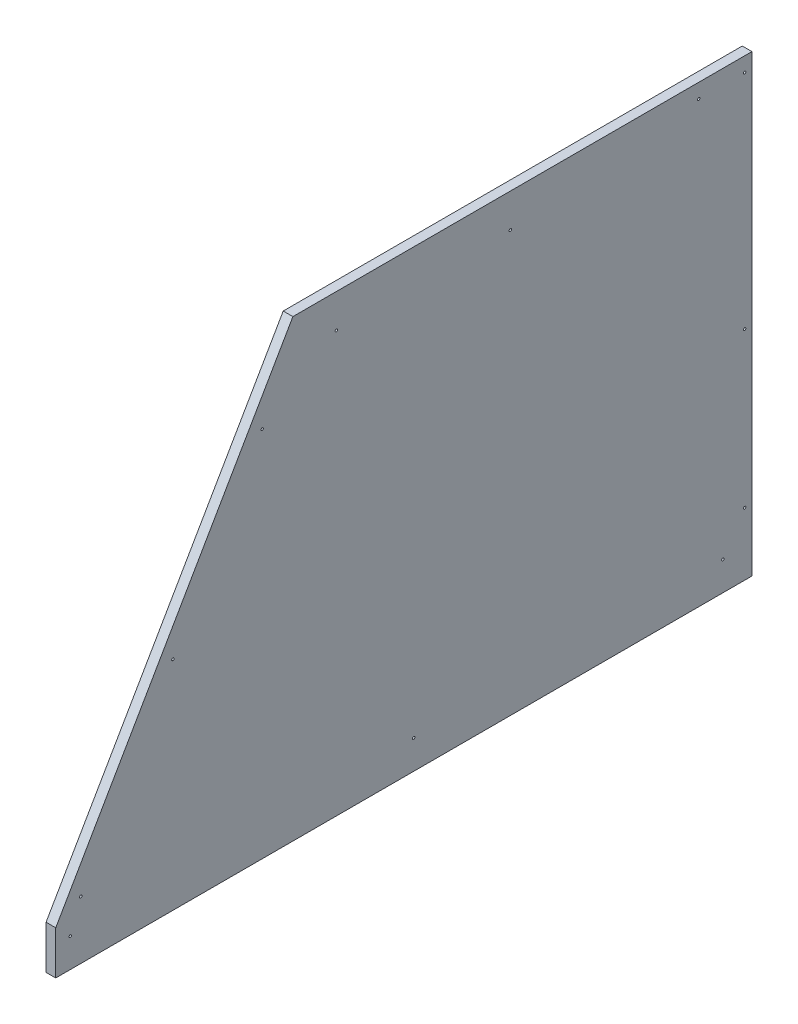
ISO-10303-21;
HEADER;
FILE_DESCRIPTION(('STEP AP214'),'2;1');
FILE_NAME('part.step','',(''),(''),'','','');
FILE_SCHEMA(('AUTOMOTIVE_DESIGN { 1 0 10303 214 1 1 1 1 }'));
ENDSEC;
DATA;
#1=APPLICATION_CONTEXT('core data for automotive mechanical design processes');
#2=APPLICATION_PROTOCOL_DEFINITION('international standard','automotive_design',2000,#1);
#3=PRODUCT_CONTEXT('',#1,'mechanical');
#4=PRODUCT('Part','Part','',(#3));
#5=PRODUCT_RELATED_PRODUCT_CATEGORY('part','',(#4));
#6=PRODUCT_DEFINITION_FORMATION('','',#4);
#7=PRODUCT_DEFINITION_CONTEXT('part definition',#1,'design');
#8=PRODUCT_DEFINITION('design','',#6,#7);
#9=PRODUCT_DEFINITION_SHAPE('','',#8);
#10=(LENGTH_UNIT() NAMED_UNIT(*) SI_UNIT(.MILLI.,.METRE.));
#11=(NAMED_UNIT(*) PLANE_ANGLE_UNIT() SI_UNIT($,.RADIAN.));
#12=(NAMED_UNIT(*) SI_UNIT($,.STERADIAN.) SOLID_ANGLE_UNIT());
#13=UNCERTAINTY_MEASURE_WITH_UNIT(LENGTH_MEASURE(1.E-05),#10,'distance_accuracy_value','');
#14=(GEOMETRIC_REPRESENTATION_CONTEXT(3) GLOBAL_UNCERTAINTY_ASSIGNED_CONTEXT((#13)) GLOBAL_UNIT_ASSIGNED_CONTEXT((#10,
#11,#12)) REPRESENTATION_CONTEXT('',''));
#15=CARTESIAN_POINT('',(0.,0.,0.));
#16=DIRECTION('',(0.,0.,1.));
#17=DIRECTION('',(1.,0.,0.));
#18=AXIS2_PLACEMENT_3D('',#15,#16,#17);
#19=CARTESIAN_POINT('',(622.3,0.,0.));
#20=DIRECTION('',(-1.,0.,0.));
#21=DIRECTION('',(0.,0.,1.));
#22=AXIS2_PLACEMENT_3D('',#19,#20,#21);
#23=PLANE('',#22);
#24=CARTESIAN_POINT('',(622.3,82.55,-593.725));
#25=DIRECTION('',(-1.,0.,0.));
#26=DIRECTION('',(0.,0.,1.));
#27=AXIS2_PLACEMENT_3D('',#24,#25,#26);
#28=CIRCLE('',#27,1.5875);
#29=CARTESIAN_POINT('',(622.3,82.55,-592.1375));
#30=VERTEX_POINT('',#29);
#31=EDGE_CURVE('E121',#30,#30,#28,.T.);
#32=ORIENTED_EDGE('',*,*,#31,.T.);
#33=EDGE_LOOP('',(#32));
#34=FACE_BOUND('',#33,.T.);
#35=CARTESIAN_POINT('',(622.3,488.95,40.3279163028834));
#36=DIRECTION('',(-1.,0.,0.));
#37=DIRECTION('',(0.,0.,1.));
#38=AXIS2_PLACEMENT_3D('',#35,#36,#37);
#39=CIRCLE('',#38,1.5875);
#40=CARTESIAN_POINT('',(622.3,488.95,41.9154163028834));
#41=VERTEX_POINT('',#40);
#42=EDGE_CURVE('E125',#41,#41,#39,.T.);
#43=ORIENTED_EDGE('',*,*,#42,.T.);
#44=EDGE_LOOP('',(#43));
#45=FACE_BOUND('',#44,.T.);
#46=CARTESIAN_POINT('',(622.3,552.45,-285.75));
#47=DIRECTION('',(-1.,0.,0.));
#48=DIRECTION('',(0.,0.,1.));
#49=AXIS2_PLACEMENT_3D('',#46,#47,#48);
#50=CIRCLE('',#49,1.5875);
#51=CARTESIAN_POINT('',(622.3,552.45,-284.1625));
#52=VERTEX_POINT('',#51);
#53=EDGE_CURVE('E128',#52,#52,#50,.T.);
#54=ORIENTED_EDGE('',*,*,#53,.T.);
#55=EDGE_LOOP('',(#54));
#56=FACE_BOUND('',#55,.T.);
#57=CARTESIAN_POINT('',(622.3,38.1,-158.75));
#58=DIRECTION('',(-1.,0.,0.));
#59=DIRECTION('',(0.,0.,1.));
#60=AXIS2_PLACEMENT_3D('',#57,#58,#59);
#61=CIRCLE('',#60,1.5875);
#62=CARTESIAN_POINT('',(622.3,38.1,-157.1625));
#63=VERTEX_POINT('',#62);
#64=EDGE_CURVE('E131',#63,#63,#61,.T.);
#65=ORIENTED_EDGE('',*,*,#64,.T.);
#66=EDGE_LOOP('',(#65));
#67=FACE_BOUND('',#66,.T.);
#68=CARTESIAN_POINT('',(622.3,285.75,157.645491002215));
#69=DIRECTION('',(-1.,0.,0.));
#70=DIRECTION('',(0.,0.,1.));
#71=AXIS2_PLACEMENT_3D('',#68,#69,#70);
#72=CIRCLE('',#71,1.5875);
#73=CARTESIAN_POINT('',(622.3,285.75,159.232991002215));
#74=VERTEX_POINT('',#73);
#75=EDGE_CURVE('E134',#74,#74,#72,.T.);
#76=ORIENTED_EDGE('',*,*,#75,.T.);
#77=EDGE_LOOP('',(#76));
#78=FACE_BOUND('',#77,.T.);
#79=CARTESIAN_POINT('',(622.3,38.1,292.574807795112));
#80=DIRECTION('',(-1.,0.,0.));
#81=DIRECTION('',(0.,0.,1.));
#82=AXIS2_PLACEMENT_3D('',#79,#80,#81);
#83=CIRCLE('',#82,1.5875);
#84=CARTESIAN_POINT('',(622.3,38.1,294.162307795112));
#85=VERTEX_POINT('',#84);
#86=EDGE_CURVE('E137',#85,#85,#83,.T.);
#87=ORIENTED_EDGE('',*,*,#86,.T.);
#88=EDGE_LOOP('',(#87));
#89=FACE_BOUND('',#88,.T.);
#90=CARTESIAN_POINT('',(622.3,38.1,-565.15));
#91=DIRECTION('',(-1.,0.,0.));
#92=DIRECTION('',(0.,0.,1.));
#93=AXIS2_PLACEMENT_3D('',#90,#91,#92);
#94=CIRCLE('',#93,1.5875);
#95=CARTESIAN_POINT('',(622.3,38.1,-563.5625));
#96=VERTEX_POINT('',#95);
#97=EDGE_CURVE('E140',#96,#96,#94,.T.);
#98=ORIENTED_EDGE('',*,*,#97,.T.);
#99=EDGE_LOOP('',(#98));
#100=FACE_BOUND('',#99,.T.);
#101=CARTESIAN_POINT('',(622.3,285.75,-593.725));
#102=DIRECTION('',(-1.,0.,0.));
#103=DIRECTION('',(0.,0.,1.));
#104=AXIS2_PLACEMENT_3D('',#101,#102,#103);
#105=CIRCLE('',#104,1.5875);
#106=CARTESIAN_POINT('',(622.3,285.75,-592.1375));
#107=VERTEX_POINT('',#106);
#108=EDGE_CURVE('E143',#107,#107,#105,.T.);
#109=ORIENTED_EDGE('',*,*,#108,.T.);
#110=EDGE_LOOP('',(#109));
#111=FACE_BOUND('',#110,.T.);
#112=CARTESIAN_POINT('',(622.3,577.85,-593.725));
#113=DIRECTION('',(-1.,0.,0.));
#114=DIRECTION('',(0.,0.,1.));
#115=AXIS2_PLACEMENT_3D('',#112,#113,#114);
#116=CIRCLE('',#115,1.5875);
#117=CARTESIAN_POINT('',(622.3,577.85,-592.1375));
#118=VERTEX_POINT('',#117);
#119=EDGE_CURVE('E146',#118,#118,#116,.T.);
#120=ORIENTED_EDGE('',*,*,#119,.T.);
#121=EDGE_LOOP('',(#120));
#122=FACE_BOUND('',#121,.T.);
#123=CARTESIAN_POINT('',(622.3,76.2,278.62923991084));
#124=DIRECTION('',(-1.,0.,0.));
#125=DIRECTION('',(0.,0.,1.));
#126=AXIS2_PLACEMENT_3D('',#123,#124,#125);
#127=CIRCLE('',#126,1.5875);
#128=CARTESIAN_POINT('',(622.3,76.2,280.21673991084));
#129=VERTEX_POINT('',#128);
#130=EDGE_CURVE('E149',#129,#129,#127,.T.);
#131=ORIENTED_EDGE('',*,*,#130,.T.);
#132=EDGE_LOOP('',(#131));
#133=FACE_BOUND('',#132,.T.);
#134=CARTESIAN_POINT('',(622.3,552.45,-57.15));
#135=DIRECTION('',(-1.,0.,0.));
#136=DIRECTION('',(0.,0.,1.));
#137=AXIS2_PLACEMENT_3D('',#134,#135,#136);
#138=CIRCLE('',#137,1.5875);
#139=CARTESIAN_POINT('',(622.3,552.45,-55.5625));
#140=VERTEX_POINT('',#139);
#141=EDGE_CURVE('E151',#140,#140,#138,.T.);
#142=ORIENTED_EDGE('',*,*,#141,.T.);
#143=EDGE_LOOP('',(#142));
#144=FACE_BOUND('',#143,.T.);
#145=CARTESIAN_POINT('',(622.3,577.85,-533.4));
#146=DIRECTION('',(-1.,0.,0.));
#147=DIRECTION('',(0.,0.,1.));
#148=AXIS2_PLACEMENT_3D('',#145,#146,#147);
#149=CIRCLE('',#148,1.5875);
#150=CARTESIAN_POINT('',(622.3,577.85,-531.8125));
#151=VERTEX_POINT('',#150);
#152=EDGE_CURVE('E19',#151,#151,#149,.T.);
#153=ORIENTED_EDGE('',*,*,#152,.T.);
#154=EDGE_LOOP('',(#153));
#155=FACE_BOUND('',#154,.T.);
#156=DIRECTION('',(0.,0.866025403784429,-0.500000000000017));
#157=VECTOR('',#156,1.);
#158=CARTESIAN_POINT('',(622.3,57.15,311.624807795112));
#159=LINE('',#158,#157);
#160=CARTESIAN_POINT('',(622.3,596.9,-4.57966997657877E-13));
#161=VERTEX_POINT('',#160);
#162=CARTESIAN_POINT('',(622.3,57.15,311.624807795112));
#163=VERTEX_POINT('',#162);
#164=EDGE_CURVE('E61',#161,#163,#159,.F.);
#165=ORIENTED_EDGE('',*,*,#164,.T.);
#166=DIRECTION('',(0.,1.,0.));
#167=VECTOR('',#166,1.);
#168=CARTESIAN_POINT('',(622.3,0.,311.624807795112));
#169=LINE('',#168,#167);
#170=CARTESIAN_POINT('',(622.3,0.,311.624807795112));
#171=VERTEX_POINT('',#170);
#172=EDGE_CURVE('E63',#163,#171,#169,.F.);
#173=ORIENTED_EDGE('',*,*,#172,.T.);
#174=DIRECTION('',(0.,0.,1.));
#175=VECTOR('',#174,1.);
#176=CARTESIAN_POINT('',(622.3,0.,0.));
#177=LINE('',#176,#175);
#178=CARTESIAN_POINT('',(622.3,0.,-603.25));
#179=VERTEX_POINT('',#178);
#180=EDGE_CURVE('E65',#171,#179,#177,.F.);
#181=ORIENTED_EDGE('',*,*,#180,.T.);
#182=DIRECTION('',(0.,1.,0.));
#183=VECTOR('',#182,1.);
#184=CARTESIAN_POINT('',(622.3,596.9,-603.25));
#185=LINE('',#184,#183);
#186=CARTESIAN_POINT('',(622.3,596.9,-603.25));
#187=VERTEX_POINT('',#186);
#188=EDGE_CURVE('E158',#179,#187,#185,.T.);
#189=ORIENTED_EDGE('',*,*,#188,.T.);
#190=DIRECTION('',(0.,0.,-1.));
#191=VECTOR('',#190,1.);
#192=CARTESIAN_POINT('',(622.3,596.9,0.));
#193=LINE('',#192,#191);
#194=EDGE_CURVE('E167',#187,#161,#193,.F.);
#195=ORIENTED_EDGE('',*,*,#194,.T.);
#196=EDGE_LOOP('',(#165,#173,#181,#189,#195));
#197=FACE_BOUND('',#196,.T.);
#198=ADVANCED_FACE('F16',(#34,#45,#56,#67,#78,#89,#100,#111,#122,#133,#144,#155,#197),#23,.F.);
#199=CARTESIAN_POINT('',(609.6,0.,0.));
#200=DIRECTION('',(0.,1.,0.));
#201=DIRECTION('',(0.,0.,1.));
#202=AXIS2_PLACEMENT_3D('',#199,#200,#201);
#203=PLANE('',#202);
#204=ORIENTED_EDGE('',*,*,#180,.F.);
#205=DIRECTION('',(-1.,0.,0.));
#206=VECTOR('',#205,1.);
#207=CARTESIAN_POINT('',(609.6,0.,311.624807795112));
#208=LINE('',#207,#206);
#209=CARTESIAN_POINT('',(609.6,0.,311.624807795112));
#210=VERTEX_POINT('',#209);
#211=EDGE_CURVE('E70',#171,#210,#208,.T.);
#212=ORIENTED_EDGE('',*,*,#211,.T.);
#213=DIRECTION('',(0.,0.,1.));
#214=VECTOR('',#213,1.);
#215=CARTESIAN_POINT('',(609.6,0.,0.));
#216=LINE('',#215,#214);
#217=CARTESIAN_POINT('',(609.6,0.,-603.25));
#218=VERTEX_POINT('',#217);
#219=EDGE_CURVE('E124',#218,#210,#216,.T.);
#220=ORIENTED_EDGE('',*,*,#219,.F.);
#221=DIRECTION('',(1.,0.,0.));
#222=VECTOR('',#221,1.);
#223=CARTESIAN_POINT('',(609.6,0.,-603.25));
#224=LINE('',#223,#222);
#225=EDGE_CURVE('E77',#218,#179,#224,.T.);
#226=ORIENTED_EDGE('',*,*,#225,.T.);
#227=EDGE_LOOP('',(#204,#212,#220,#226));
#228=FACE_BOUND('',#227,.T.);
#229=ADVANCED_FACE('F74',(#228),#203,.F.);
#230=CARTESIAN_POINT('',(609.6,0.,311.624807795112));
#231=DIRECTION('',(0.,0.,-1.));
#232=DIRECTION('',(-1.,0.,0.));
#233=AXIS2_PLACEMENT_3D('',#230,#231,#232);
#234=PLANE('',#233);
#235=ORIENTED_EDGE('',*,*,#172,.F.);
#236=DIRECTION('',(1.,0.,0.));
#237=VECTOR('',#236,1.);
#238=CARTESIAN_POINT('',(609.6,57.15,311.624807795112));
#239=LINE('',#238,#237);
#240=CARTESIAN_POINT('',(609.6,57.15,311.624807795112));
#241=VERTEX_POINT('',#240);
#242=EDGE_CURVE('E84',#163,#241,#239,.F.);
#243=ORIENTED_EDGE('',*,*,#242,.T.);
#244=DIRECTION('',(0.,1.,0.));
#245=VECTOR('',#244,1.);
#246=CARTESIAN_POINT('',(609.6,0.,311.624807795112));
#247=LINE('',#246,#245);
#248=EDGE_CURVE('E82',#210,#241,#247,.T.);
#249=ORIENTED_EDGE('',*,*,#248,.F.);
#250=ORIENTED_EDGE('',*,*,#211,.F.);
#251=EDGE_LOOP('',(#235,#243,#249,#250));
#252=FACE_BOUND('',#251,.T.);
#253=ADVANCED_FACE('F80',(#252),#234,.F.);
#254=CARTESIAN_POINT('',(609.6,57.15,311.624807795112));
#255=DIRECTION('',(0.,-0.500000000000017,-0.866025403784429));
#256=DIRECTION('',(0.,0.866025403784429,-0.500000000000017));
#257=AXIS2_PLACEMENT_3D('',#254,#255,#256);
#258=PLANE('',#257);
#259=ORIENTED_EDGE('',*,*,#164,.F.);
#260=DIRECTION('',(1.,0.,0.));
#261=VECTOR('',#260,1.);
#262=CARTESIAN_POINT('',(609.6,596.9,0.));
#263=LINE('',#262,#261);
#264=CARTESIAN_POINT('',(609.6,596.9,-9.15933995315754E-13));
#265=VERTEX_POINT('',#264);
#266=EDGE_CURVE('E165',#161,#265,#263,.F.);
#267=ORIENTED_EDGE('',*,*,#266,.T.);
#268=DIRECTION('',(0.,0.866025403784431,-0.500000000000014));
#269=VECTOR('',#268,1.);
#270=CARTESIAN_POINT('',(609.6,57.15,311.624807795112));
#271=LINE('',#270,#269);
#272=EDGE_CURVE('E171',#241,#265,#271,.T.);
#273=ORIENTED_EDGE('',*,*,#272,.F.);
#274=ORIENTED_EDGE('',*,*,#242,.F.);
#275=EDGE_LOOP('',(#259,#267,#273,#274));
#276=FACE_BOUND('',#275,.T.);
#277=ADVANCED_FACE('F172',(#276),#258,.F.);
#278=CARTESIAN_POINT('',(609.6,596.9,0.));
#279=DIRECTION('',(0.,-1.,0.));
#280=DIRECTION('',(0.,0.,-1.));
#281=AXIS2_PLACEMENT_3D('',#278,#279,#280);
#282=PLANE('',#281);
#283=ORIENTED_EDGE('',*,*,#194,.F.);
#284=DIRECTION('',(1.,0.,0.));
#285=VECTOR('',#284,1.);
#286=CARTESIAN_POINT('',(609.6,596.9,-603.25));
#287=LINE('',#286,#285);
#288=CARTESIAN_POINT('',(609.6,596.9,-603.25));
#289=VERTEX_POINT('',#288);
#290=EDGE_CURVE('E34',#187,#289,#287,.F.);
#291=ORIENTED_EDGE('',*,*,#290,.T.);
#292=DIRECTION('',(0.,0.,1.));
#293=VECTOR('',#292,1.);
#294=CARTESIAN_POINT('',(609.6,596.9,0.));
#295=LINE('',#294,#293);
#296=EDGE_CURVE('E176',#265,#289,#295,.F.);
#297=ORIENTED_EDGE('',*,*,#296,.F.);
#298=ORIENTED_EDGE('',*,*,#266,.F.);
#299=EDGE_LOOP('',(#283,#291,#297,#298));
#300=FACE_BOUND('',#299,.T.);
#301=ADVANCED_FACE('F184',(#300),#282,.F.);
#302=CARTESIAN_POINT('',(609.6,596.9,-603.25));
#303=DIRECTION('',(0.,0.,1.));
#304=DIRECTION('',(1.,0.,0.));
#305=AXIS2_PLACEMENT_3D('',#302,#303,#304);
#306=PLANE('',#305);
#307=ORIENTED_EDGE('',*,*,#188,.F.);
#308=ORIENTED_EDGE('',*,*,#225,.F.);
#309=DIRECTION('',(0.,1.,0.));
#310=VECTOR('',#309,1.);
#311=CARTESIAN_POINT('',(609.6,0.,-603.25));
#312=LINE('',#311,#310);
#313=EDGE_CURVE('E120',#289,#218,#312,.F.);
#314=ORIENTED_EDGE('',*,*,#313,.F.);
#315=ORIENTED_EDGE('',*,*,#290,.F.);
#316=EDGE_LOOP('',(#307,#308,#314,#315));
#317=FACE_BOUND('',#316,.T.);
#318=ADVANCED_FACE('F183',(#317),#306,.F.);
#319=CARTESIAN_POINT('',(-622.3,577.85,-533.4));
#320=DIRECTION('',(-1.,0.,0.));
#321=DIRECTION('',(0.,0.,1.));
#322=AXIS2_PLACEMENT_3D('',#319,#320,#321);
#323=CYLINDRICAL_SURFACE('',#322,1.5875);
#324=ORIENTED_EDGE('',*,*,#152,.F.);
#325=EDGE_LOOP('',(#324));
#326=FACE_BOUND('',#325,.T.);
#327=CARTESIAN_POINT('',(609.6,577.85,-533.4));
#328=DIRECTION('',(-1.,0.,0.));
#329=DIRECTION('',(0.,0.,1.));
#330=AXIS2_PLACEMENT_3D('',#327,#328,#329);
#331=CIRCLE('',#330,1.5875);
#332=CARTESIAN_POINT('',(609.6,577.85,-531.8125));
#333=VERTEX_POINT('',#332);
#334=EDGE_CURVE('E117',#333,#333,#331,.F.);
#335=ORIENTED_EDGE('',*,*,#334,.F.);
#336=EDGE_LOOP('',(#335));
#337=FACE_BOUND('',#336,.T.);
#338=ADVANCED_FACE('F192',(#326,#337),#323,.F.);
#339=CARTESIAN_POINT('',(-622.3,552.45,-57.15));
#340=DIRECTION('',(-1.,0.,0.));
#341=DIRECTION('',(0.,0.,1.));
#342=AXIS2_PLACEMENT_3D('',#339,#340,#341);
#343=CYLINDRICAL_SURFACE('',#342,1.5875);
#344=ORIENTED_EDGE('',*,*,#141,.F.);
#345=EDGE_LOOP('',(#344));
#346=FACE_BOUND('',#345,.T.);
#347=CARTESIAN_POINT('',(609.6,552.45,-57.15));
#348=DIRECTION('',(-1.,0.,0.));
#349=DIRECTION('',(0.,0.,1.));
#350=AXIS2_PLACEMENT_3D('',#347,#348,#349);
#351=CIRCLE('',#350,1.5875);
#352=CARTESIAN_POINT('',(609.6,552.45,-55.5625));
#353=VERTEX_POINT('',#352);
#354=EDGE_CURVE('E114',#353,#353,#351,.F.);
#355=ORIENTED_EDGE('',*,*,#354,.F.);
#356=EDGE_LOOP('',(#355));
#357=FACE_BOUND('',#356,.T.);
#358=ADVANCED_FACE('F241',(#346,#357),#343,.F.);
#359=CARTESIAN_POINT('',(-622.3,76.2,278.62923991084));
#360=DIRECTION('',(-1.,0.,0.));
#361=DIRECTION('',(0.,0.,1.));
#362=AXIS2_PLACEMENT_3D('',#359,#360,#361);
#363=CYLINDRICAL_SURFACE('',#362,1.5875);
#364=ORIENTED_EDGE('',*,*,#130,.F.);
#365=EDGE_LOOP('',(#364));
#366=FACE_BOUND('',#365,.T.);
#367=CARTESIAN_POINT('',(609.6,76.2,278.62923991084));
#368=DIRECTION('',(-1.,0.,0.));
#369=DIRECTION('',(0.,0.,1.));
#370=AXIS2_PLACEMENT_3D('',#367,#368,#369);
#371=CIRCLE('',#370,1.5875);
#372=CARTESIAN_POINT('',(609.6,76.2,280.21673991084));
#373=VERTEX_POINT('',#372);
#374=EDGE_CURVE('E111',#373,#373,#371,.F.);
#375=ORIENTED_EDGE('',*,*,#374,.F.);
#376=EDGE_LOOP('',(#375));
#377=FACE_BOUND('',#376,.T.);
#378=ADVANCED_FACE('F237',(#366,#377),#363,.F.);
#379=CARTESIAN_POINT('',(-622.3,577.85,-593.725));
#380=DIRECTION('',(-1.,0.,0.));
#381=DIRECTION('',(0.,0.,1.));
#382=AXIS2_PLACEMENT_3D('',#379,#380,#381);
#383=CYLINDRICAL_SURFACE('',#382,1.5875);
#384=ORIENTED_EDGE('',*,*,#119,.F.);
#385=EDGE_LOOP('',(#384));
#386=FACE_BOUND('',#385,.T.);
#387=CARTESIAN_POINT('',(609.6,577.85,-593.725));
#388=DIRECTION('',(-1.,0.,0.));
#389=DIRECTION('',(0.,0.,1.));
#390=AXIS2_PLACEMENT_3D('',#387,#388,#389);
#391=CIRCLE('',#390,1.5875);
#392=CARTESIAN_POINT('',(609.6,577.85,-592.1375));
#393=VERTEX_POINT('',#392);
#394=EDGE_CURVE('E108',#393,#393,#391,.F.);
#395=ORIENTED_EDGE('',*,*,#394,.F.);
#396=EDGE_LOOP('',(#395));
#397=FACE_BOUND('',#396,.T.);
#398=ADVANCED_FACE('F233',(#386,#397),#383,.F.);
#399=CARTESIAN_POINT('',(-622.3,285.75,-593.725));
#400=DIRECTION('',(-1.,0.,0.));
#401=DIRECTION('',(0.,0.,1.));
#402=AXIS2_PLACEMENT_3D('',#399,#400,#401);
#403=CYLINDRICAL_SURFACE('',#402,1.5875);
#404=ORIENTED_EDGE('',*,*,#108,.F.);
#405=EDGE_LOOP('',(#404));
#406=FACE_BOUND('',#405,.T.);
#407=CARTESIAN_POINT('',(609.6,285.75,-593.725));
#408=DIRECTION('',(-1.,0.,0.));
#409=DIRECTION('',(0.,0.,1.));
#410=AXIS2_PLACEMENT_3D('',#407,#408,#409);
#411=CIRCLE('',#410,1.5875);
#412=CARTESIAN_POINT('',(609.6,285.75,-592.1375));
#413=VERTEX_POINT('',#412);
#414=EDGE_CURVE('E105',#413,#413,#411,.F.);
#415=ORIENTED_EDGE('',*,*,#414,.F.);
#416=EDGE_LOOP('',(#415));
#417=FACE_BOUND('',#416,.T.);
#418=ADVANCED_FACE('F229',(#406,#417),#403,.F.);
#419=CARTESIAN_POINT('',(-622.3,38.1,-565.15));
#420=DIRECTION('',(-1.,0.,0.));
#421=DIRECTION('',(0.,0.,1.));
#422=AXIS2_PLACEMENT_3D('',#419,#420,#421);
#423=CYLINDRICAL_SURFACE('',#422,1.5875);
#424=ORIENTED_EDGE('',*,*,#97,.F.);
#425=EDGE_LOOP('',(#424));
#426=FACE_BOUND('',#425,.T.);
#427=CARTESIAN_POINT('',(609.6,38.1,-565.15));
#428=DIRECTION('',(-1.,0.,0.));
#429=DIRECTION('',(0.,0.,1.));
#430=AXIS2_PLACEMENT_3D('',#427,#428,#429);
#431=CIRCLE('',#430,1.5875);
#432=CARTESIAN_POINT('',(609.6,38.1,-563.5625));
#433=VERTEX_POINT('',#432);
#434=EDGE_CURVE('E102',#433,#433,#431,.F.);
#435=ORIENTED_EDGE('',*,*,#434,.F.);
#436=EDGE_LOOP('',(#435));
#437=FACE_BOUND('',#436,.T.);
#438=ADVANCED_FACE('F225',(#426,#437),#423,.F.);
#439=CARTESIAN_POINT('',(-622.3,38.1,292.574807795112));
#440=DIRECTION('',(-1.,0.,0.));
#441=DIRECTION('',(0.,0.,1.));
#442=AXIS2_PLACEMENT_3D('',#439,#440,#441);
#443=CYLINDRICAL_SURFACE('',#442,1.5875);
#444=ORIENTED_EDGE('',*,*,#86,.F.);
#445=EDGE_LOOP('',(#444));
#446=FACE_BOUND('',#445,.T.);
#447=CARTESIAN_POINT('',(609.6,38.1,292.574807795112));
#448=DIRECTION('',(-1.,0.,0.));
#449=DIRECTION('',(0.,0.,1.));
#450=AXIS2_PLACEMENT_3D('',#447,#448,#449);
#451=CIRCLE('',#450,1.5875);
#452=CARTESIAN_POINT('',(609.6,38.1,294.162307795112));
#453=VERTEX_POINT('',#452);
#454=EDGE_CURVE('E99',#453,#453,#451,.F.);
#455=ORIENTED_EDGE('',*,*,#454,.F.);
#456=EDGE_LOOP('',(#455));
#457=FACE_BOUND('',#456,.T.);
#458=ADVANCED_FACE('F221',(#446,#457),#443,.F.);
#459=CARTESIAN_POINT('',(-622.3,285.75,157.645491002215));
#460=DIRECTION('',(-1.,0.,0.));
#461=DIRECTION('',(0.,0.,1.));
#462=AXIS2_PLACEMENT_3D('',#459,#460,#461);
#463=CYLINDRICAL_SURFACE('',#462,1.5875);
#464=ORIENTED_EDGE('',*,*,#75,.F.);
#465=EDGE_LOOP('',(#464));
#466=FACE_BOUND('',#465,.T.);
#467=CARTESIAN_POINT('',(609.6,285.75,157.645491002215));
#468=DIRECTION('',(-1.,0.,0.));
#469=DIRECTION('',(0.,0.,1.));
#470=AXIS2_PLACEMENT_3D('',#467,#468,#469);
#471=CIRCLE('',#470,1.5875);
#472=CARTESIAN_POINT('',(609.6,285.75,159.232991002215));
#473=VERTEX_POINT('',#472);
#474=EDGE_CURVE('E96',#473,#473,#471,.F.);
#475=ORIENTED_EDGE('',*,*,#474,.F.);
#476=EDGE_LOOP('',(#475));
#477=FACE_BOUND('',#476,.T.);
#478=ADVANCED_FACE('F217',(#466,#477),#463,.F.);
#479=CARTESIAN_POINT('',(-622.3,38.1,-158.75));
#480=DIRECTION('',(-1.,0.,0.));
#481=DIRECTION('',(0.,0.,1.));
#482=AXIS2_PLACEMENT_3D('',#479,#480,#481);
#483=CYLINDRICAL_SURFACE('',#482,1.5875);
#484=ORIENTED_EDGE('',*,*,#64,.F.);
#485=EDGE_LOOP('',(#484));
#486=FACE_BOUND('',#485,.T.);
#487=CARTESIAN_POINT('',(609.6,38.1,-158.75));
#488=DIRECTION('',(-1.,0.,0.));
#489=DIRECTION('',(0.,0.,1.));
#490=AXIS2_PLACEMENT_3D('',#487,#488,#489);
#491=CIRCLE('',#490,1.5875);
#492=CARTESIAN_POINT('',(609.6,38.1,-157.1625));
#493=VERTEX_POINT('',#492);
#494=EDGE_CURVE('E93',#493,#493,#491,.F.);
#495=ORIENTED_EDGE('',*,*,#494,.F.);
#496=EDGE_LOOP('',(#495));
#497=FACE_BOUND('',#496,.T.);
#498=ADVANCED_FACE('F213',(#486,#497),#483,.F.);
#499=CARTESIAN_POINT('',(-622.3,552.45,-285.75));
#500=DIRECTION('',(-1.,0.,0.));
#501=DIRECTION('',(0.,0.,1.));
#502=AXIS2_PLACEMENT_3D('',#499,#500,#501);
#503=CYLINDRICAL_SURFACE('',#502,1.5875);
#504=ORIENTED_EDGE('',*,*,#53,.F.);
#505=EDGE_LOOP('',(#504));
#506=FACE_BOUND('',#505,.T.);
#507=CARTESIAN_POINT('',(609.6,552.45,-285.75));
#508=DIRECTION('',(-1.,0.,0.));
#509=DIRECTION('',(0.,0.,1.));
#510=AXIS2_PLACEMENT_3D('',#507,#508,#509);
#511=CIRCLE('',#510,1.5875);
#512=CARTESIAN_POINT('',(609.6,552.45,-284.1625));
#513=VERTEX_POINT('',#512);
#514=EDGE_CURVE('E90',#513,#513,#511,.F.);
#515=ORIENTED_EDGE('',*,*,#514,.F.);
#516=EDGE_LOOP('',(#515));
#517=FACE_BOUND('',#516,.T.);
#518=ADVANCED_FACE('F209',(#506,#517),#503,.F.);
#519=CARTESIAN_POINT('',(-622.3,488.95,40.3279163028834));
#520=DIRECTION('',(-1.,0.,0.));
#521=DIRECTION('',(0.,0.,1.));
#522=AXIS2_PLACEMENT_3D('',#519,#520,#521);
#523=CYLINDRICAL_SURFACE('',#522,1.5875);
#524=ORIENTED_EDGE('',*,*,#42,.F.);
#525=EDGE_LOOP('',(#524));
#526=FACE_BOUND('',#525,.T.);
#527=CARTESIAN_POINT('',(609.6,488.95,40.3279163028834));
#528=DIRECTION('',(-1.,0.,0.));
#529=DIRECTION('',(0.,0.,1.));
#530=AXIS2_PLACEMENT_3D('',#527,#528,#529);
#531=CIRCLE('',#530,1.5875);
#532=CARTESIAN_POINT('',(609.6,488.95,41.9154163028834));
#533=VERTEX_POINT('',#532);
#534=EDGE_CURVE('E25',#533,#533,#531,.F.);
#535=ORIENTED_EDGE('',*,*,#534,.F.);
#536=EDGE_LOOP('',(#535));
#537=FACE_BOUND('',#536,.T.);
#538=ADVANCED_FACE('F202',(#526,#537),#523,.F.);
#539=CARTESIAN_POINT('',(-622.3,82.55,-593.725));
#540=DIRECTION('',(-1.,0.,0.));
#541=DIRECTION('',(0.,0.,1.));
#542=AXIS2_PLACEMENT_3D('',#539,#540,#541);
#543=CYLINDRICAL_SURFACE('',#542,1.5875);
#544=ORIENTED_EDGE('',*,*,#31,.F.);
#545=EDGE_LOOP('',(#544));
#546=FACE_BOUND('',#545,.T.);
#547=CARTESIAN_POINT('',(609.6,82.55,-593.725));
#548=DIRECTION('',(-1.,0.,0.));
#549=DIRECTION('',(0.,0.,1.));
#550=AXIS2_PLACEMENT_3D('',#547,#548,#549);
#551=CIRCLE('',#550,1.5875);
#552=CARTESIAN_POINT('',(609.6,82.55,-592.1375));
#553=VERTEX_POINT('',#552);
#554=EDGE_CURVE('E11',#553,#553,#551,.F.);
#555=ORIENTED_EDGE('',*,*,#554,.F.);
#556=EDGE_LOOP('',(#555));
#557=FACE_BOUND('',#556,.T.);
#558=ADVANCED_FACE('F196',(#546,#557),#543,.F.);
#559=CARTESIAN_POINT('',(609.6,0.,0.));
#560=DIRECTION('',(-1.,0.,0.));
#561=DIRECTION('',(0.,0.,1.));
#562=AXIS2_PLACEMENT_3D('',#559,#560,#561);
#563=PLANE('',#562);
#564=ORIENTED_EDGE('',*,*,#554,.T.);
#565=EDGE_LOOP('',(#564));
#566=FACE_BOUND('',#565,.T.);
#567=ORIENTED_EDGE('',*,*,#534,.T.);
#568=EDGE_LOOP('',(#567));
#569=FACE_BOUND('',#568,.T.);
#570=ORIENTED_EDGE('',*,*,#514,.T.);
#571=EDGE_LOOP('',(#570));
#572=FACE_BOUND('',#571,.T.);
#573=ORIENTED_EDGE('',*,*,#494,.T.);
#574=EDGE_LOOP('',(#573));
#575=FACE_BOUND('',#574,.T.);
#576=ORIENTED_EDGE('',*,*,#474,.T.);
#577=EDGE_LOOP('',(#576));
#578=FACE_BOUND('',#577,.T.);
#579=ORIENTED_EDGE('',*,*,#454,.T.);
#580=EDGE_LOOP('',(#579));
#581=FACE_BOUND('',#580,.T.);
#582=ORIENTED_EDGE('',*,*,#434,.T.);
#583=EDGE_LOOP('',(#582));
#584=FACE_BOUND('',#583,.T.);
#585=ORIENTED_EDGE('',*,*,#414,.T.);
#586=EDGE_LOOP('',(#585));
#587=FACE_BOUND('',#586,.T.);
#588=ORIENTED_EDGE('',*,*,#394,.T.);
#589=EDGE_LOOP('',(#588));
#590=FACE_BOUND('',#589,.T.);
#591=ORIENTED_EDGE('',*,*,#374,.T.);
#592=EDGE_LOOP('',(#591));
#593=FACE_BOUND('',#592,.T.);
#594=ORIENTED_EDGE('',*,*,#354,.T.);
#595=EDGE_LOOP('',(#594));
#596=FACE_BOUND('',#595,.T.);
#597=ORIENTED_EDGE('',*,*,#334,.T.);
#598=EDGE_LOOP('',(#597));
#599=FACE_BOUND('',#598,.T.);
#600=ORIENTED_EDGE('',*,*,#296,.T.);
#601=ORIENTED_EDGE('',*,*,#313,.T.);
#602=ORIENTED_EDGE('',*,*,#219,.T.);
#603=ORIENTED_EDGE('',*,*,#248,.T.);
#604=ORIENTED_EDGE('',*,*,#272,.T.);
#605=EDGE_LOOP('',(#600,#601,#602,#603,#604));
#606=FACE_BOUND('',#605,.T.);
#607=ADVANCED_FACE('F178',(#566,#569,#572,#575,#578,#581,#584,#587,#590,#593,#596,#599,#606),
#563,.T.);
#608=CLOSED_SHELL('',(#198,#229,#253,#277,#301,#318,#338,#358,#378,#398,#418,#438,#458,#478,
#498,#518,#538,#558,#607));
#609=MANIFOLD_SOLID_BREP('B1',#608);
#610=ADVANCED_BREP_SHAPE_REPRESENTATION('',(#18,#609),#14);
#611=SHAPE_DEFINITION_REPRESENTATION(#9,#610);
ENDSEC;
END-ISO-10303-21;
